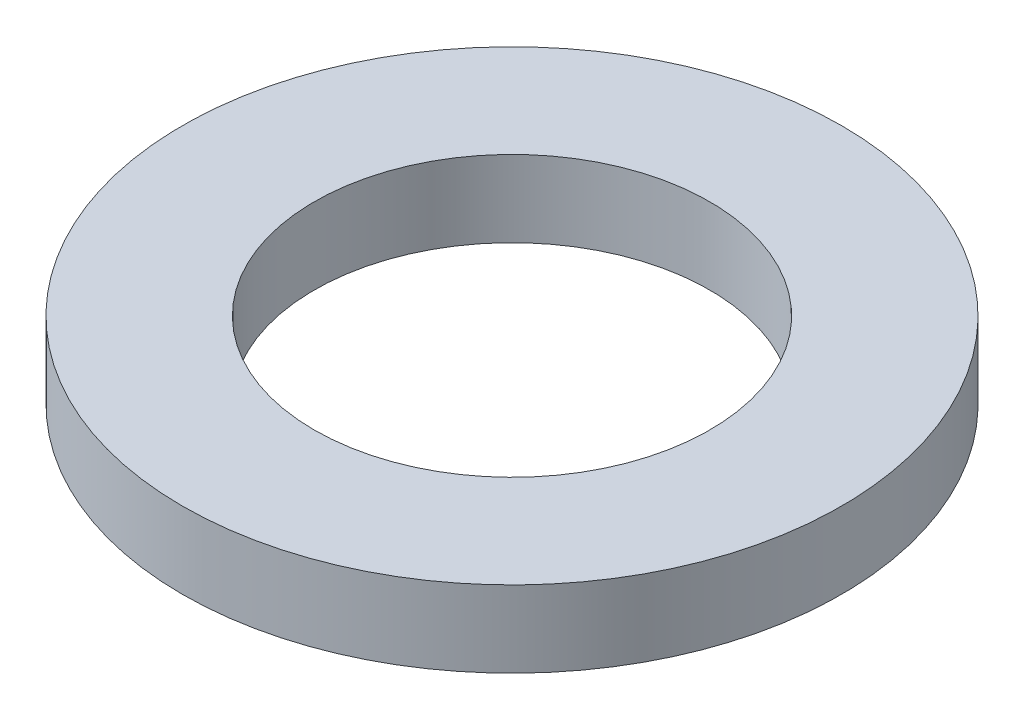
ISO-10303-21;
HEADER;
FILE_DESCRIPTION(('STEP AP214'),'2;1');
FILE_NAME('part.step','',(''),(''),'','','');
FILE_SCHEMA(('AUTOMOTIVE_DESIGN { 1 0 10303 214 1 1 1 1 }'));
ENDSEC;
DATA;
#1=APPLICATION_CONTEXT('core data for automotive mechanical design processes');
#2=APPLICATION_PROTOCOL_DEFINITION('international standard','automotive_design',2000,#1);
#3=PRODUCT_CONTEXT('',#1,'mechanical');
#4=PRODUCT('Part','Part','',(#3));
#5=PRODUCT_RELATED_PRODUCT_CATEGORY('part','',(#4));
#6=PRODUCT_DEFINITION_FORMATION('','',#4);
#7=PRODUCT_DEFINITION_CONTEXT('part definition',#1,'design');
#8=PRODUCT_DEFINITION('design','',#6,#7);
#9=PRODUCT_DEFINITION_SHAPE('','',#8);
#10=(LENGTH_UNIT() NAMED_UNIT(*) SI_UNIT(.MILLI.,.METRE.));
#11=(NAMED_UNIT(*) PLANE_ANGLE_UNIT() SI_UNIT($,.RADIAN.));
#12=(NAMED_UNIT(*) SI_UNIT($,.STERADIAN.) SOLID_ANGLE_UNIT());
#13=UNCERTAINTY_MEASURE_WITH_UNIT(LENGTH_MEASURE(1.E-05),#10,'distance_accuracy_value','');
#14=(GEOMETRIC_REPRESENTATION_CONTEXT(3) GLOBAL_UNCERTAINTY_ASSIGNED_CONTEXT((#13)) GLOBAL_UNIT_ASSIGNED_CONTEXT((#10,
#11,#12)) REPRESENTATION_CONTEXT('',''));
#15=CARTESIAN_POINT('',(0.,0.,0.));
#16=DIRECTION('',(0.,0.,1.));
#17=DIRECTION('',(1.,0.,0.));
#18=AXIS2_PLACEMENT_3D('',#15,#16,#17);
#19=CARTESIAN_POINT('',(-30.12,48.8,29.88));
#20=DIRECTION('',(0.,1.,0.));
#21=DIRECTION('',(1.,0.,0.));
#22=AXIS2_PLACEMENT_3D('',#19,#20,#21);
#23=PLANE('',#22);
#24=CARTESIAN_POINT('',(0.,48.8,60.));
#25=DIRECTION('',(0.,-1.,0.));
#26=DIRECTION('',(1.,0.,0.));
#27=AXIS2_PLACEMENT_3D('',#24,#25,#26);
#28=CIRCLE('',#27,15.);
#29=CARTESIAN_POINT('',(0.,48.8,75.));
#30=VERTEX_POINT('',#29);
#31=EDGE_CURVE('E54',#30,#30,#28,.T.);
#32=ORIENTED_EDGE('',*,*,#31,.T.);
#33=EDGE_LOOP('',(#32));
#34=FACE_BOUND('',#33,.T.);
#35=CARTESIAN_POINT('',(0.,48.8,60.));
#36=DIRECTION('',(0.,-1.,0.));
#37=DIRECTION('',(1.,0.,0.));
#38=AXIS2_PLACEMENT_3D('',#35,#36,#37);
#39=CIRCLE('',#38,25.);
#40=CARTESIAN_POINT('',(0.,48.8,85.));
#41=VERTEX_POINT('',#40);
#42=EDGE_CURVE('E68',#41,#41,#39,.T.);
#43=ORIENTED_EDGE('',*,*,#42,.F.);
#44=EDGE_LOOP('',(#43));
#45=FACE_BOUND('',#44,.T.);
#46=ADVANCED_FACE('F15',(#34,#45),#23,.T.);
#47=CARTESIAN_POINT('',(30.12,43.,29.88));
#48=DIRECTION('',(0.,-1.,0.));
#49=DIRECTION('',(0.,0.,-1.));
#50=AXIS2_PLACEMENT_3D('',#47,#48,#49);
#51=PLANE('',#50);
#52=CARTESIAN_POINT('',(0.,43.,60.));
#53=DIRECTION('',(0.,1.,0.));
#54=DIRECTION('',(-1.,0.,0.));
#55=AXIS2_PLACEMENT_3D('',#52,#53,#54);
#56=CIRCLE('',#55,15.);
#57=CARTESIAN_POINT('',(0.,43.,75.));
#58=VERTEX_POINT('',#57);
#59=EDGE_CURVE('E53',#58,#58,#56,.T.);
#60=ORIENTED_EDGE('',*,*,#59,.T.);
#61=EDGE_LOOP('',(#60));
#62=FACE_BOUND('',#61,.T.);
#63=CARTESIAN_POINT('',(0.,43.,60.));
#64=DIRECTION('',(0.,1.,0.));
#65=DIRECTION('',(1.,0.,0.));
#66=AXIS2_PLACEMENT_3D('',#63,#64,#65);
#67=CIRCLE('',#66,25.);
#68=CARTESIAN_POINT('',(0.,43.,85.));
#69=VERTEX_POINT('',#68);
#70=EDGE_CURVE('E10',#69,#69,#67,.T.);
#71=ORIENTED_EDGE('',*,*,#70,.F.);
#72=EDGE_LOOP('',(#71));
#73=FACE_BOUND('',#72,.T.);
#74=ADVANCED_FACE('F58',(#62,#73),#51,.T.);
#75=CARTESIAN_POINT('',(0.,45.9,60.));
#76=DIRECTION('',(0.,1.,0.));
#77=DIRECTION('',(0.,0.,-1.));
#78=AXIS2_PLACEMENT_3D('',#75,#76,#77);
#79=CYLINDRICAL_SURFACE('',#78,25.);
#80=ORIENTED_EDGE('',*,*,#42,.T.);
#81=DIRECTION('',(0.,-1.,0.));
#82=VECTOR('',#81,1.);
#83=CARTESIAN_POINT('',(0.,45.9,85.));
#84=LINE('',#83,#82);
#85=EDGE_CURVE('E23',#41,#69,#84,.T.);
#86=ORIENTED_EDGE('',*,*,#85,.T.);
#87=ORIENTED_EDGE('',*,*,#70,.T.);
#88=ORIENTED_EDGE('',*,*,#85,.F.);
#89=EDGE_LOOP('',(#80,#86,#87,#88));
#90=FACE_BOUND('',#89,.T.);
#91=ADVANCED_FACE('F85',(#90),#79,.T.);
#92=CARTESIAN_POINT('',(0.,45.9,60.));
#93=DIRECTION('',(0.,1.,0.));
#94=DIRECTION('',(0.,0.,-1.));
#95=AXIS2_PLACEMENT_3D('',#92,#93,#94);
#96=CYLINDRICAL_SURFACE('',#95,15.);
#97=ORIENTED_EDGE('',*,*,#59,.F.);
#98=DIRECTION('',(0.,1.,0.));
#99=VECTOR('',#98,1.);
#100=CARTESIAN_POINT('',(0.,45.9,75.));
#101=LINE('',#100,#99);
#102=EDGE_CURVE('E50',#58,#30,#101,.T.);
#103=ORIENTED_EDGE('',*,*,#102,.T.);
#104=ORIENTED_EDGE('',*,*,#31,.F.);
#105=ORIENTED_EDGE('',*,*,#102,.F.);
#106=EDGE_LOOP('',(#97,#103,#104,#105));
#107=FACE_BOUND('',#106,.T.);
#108=ADVANCED_FACE('F52',(#107),#96,.F.);
#109=CLOSED_SHELL('',(#46,#74,#91,#108));
#110=MANIFOLD_SOLID_BREP('B1',#109);
#111=ADVANCED_BREP_SHAPE_REPRESENTATION('',(#18,#110),#14);
#112=SHAPE_DEFINITION_REPRESENTATION(#9,#111);
ENDSEC;
END-ISO-10303-21;
